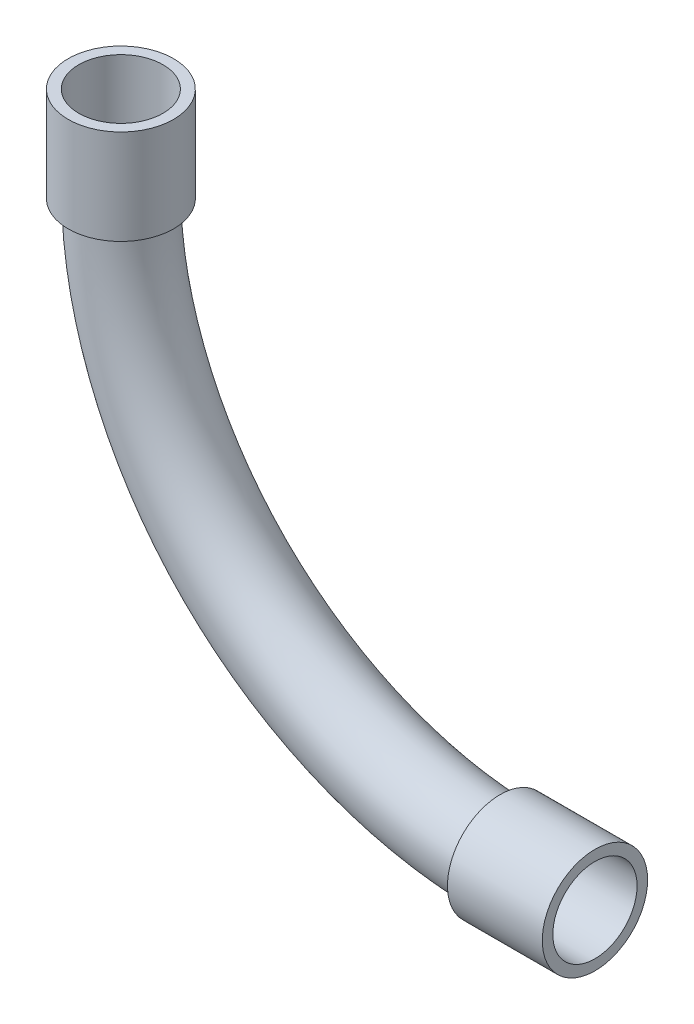
ISO-10303-21;
HEADER;
FILE_DESCRIPTION(('STEP AP214'),'2;1');
FILE_NAME('part.step','',(''),(''),'','','');
FILE_SCHEMA(('AUTOMOTIVE_DESIGN { 1 0 10303 214 1 1 1 1 }'));
ENDSEC;
DATA;
#1=APPLICATION_CONTEXT('core data for automotive mechanical design processes');
#2=APPLICATION_PROTOCOL_DEFINITION('international standard','automotive_design',2000,#1);
#3=PRODUCT_CONTEXT('',#1,'mechanical');
#4=PRODUCT('Part','Part','',(#3));
#5=PRODUCT_RELATED_PRODUCT_CATEGORY('part','',(#4));
#6=PRODUCT_DEFINITION_FORMATION('','',#4);
#7=PRODUCT_DEFINITION_CONTEXT('part definition',#1,'design');
#8=PRODUCT_DEFINITION('design','',#6,#7);
#9=PRODUCT_DEFINITION_SHAPE('','',#8);
#10=(LENGTH_UNIT() NAMED_UNIT(*) SI_UNIT(.MILLI.,.METRE.));
#11=(NAMED_UNIT(*) PLANE_ANGLE_UNIT() SI_UNIT($,.RADIAN.));
#12=(NAMED_UNIT(*) SI_UNIT($,.STERADIAN.) SOLID_ANGLE_UNIT());
#13=UNCERTAINTY_MEASURE_WITH_UNIT(LENGTH_MEASURE(1.E-05),#10,'distance_accuracy_value','');
#14=(GEOMETRIC_REPRESENTATION_CONTEXT(3) GLOBAL_UNCERTAINTY_ASSIGNED_CONTEXT((#13)) GLOBAL_UNIT_ASSIGNED_CONTEXT((#10,
#11,#12)) REPRESENTATION_CONTEXT('',''));
#15=CARTESIAN_POINT('',(0.,0.,0.));
#16=DIRECTION('',(0.,0.,1.));
#17=DIRECTION('',(1.,0.,0.));
#18=AXIS2_PLACEMENT_3D('',#15,#16,#17);
#19=CARTESIAN_POINT('',(0.,72.,0.));
#20=DIRECTION('',(0.,1.,0.));
#21=DIRECTION('',(0.,0.,1.));
#22=AXIS2_PLACEMENT_3D('',#19,#20,#21);
#23=CYLINDRICAL_SURFACE('',#22,10.);
#24=CARTESIAN_POINT('',(0.,72.,0.));
#25=DIRECTION('',(0.,1.,0.));
#26=DIRECTION('',(1.,0.,0.));
#27=AXIS2_PLACEMENT_3D('',#24,#25,#26);
#28=CIRCLE('',#27,10.);
#29=CARTESIAN_POINT('',(10.,72.,0.));
#30=VERTEX_POINT('',#29);
#31=EDGE_CURVE('E12',#30,#30,#28,.T.);
#32=ORIENTED_EDGE('',*,*,#31,.T.);
#33=EDGE_LOOP('',(#32));
#34=FACE_BOUND('',#33,.T.);
#35=CARTESIAN_POINT('',(0.,90.,0.));
#36=DIRECTION('',(0.,1.,0.));
#37=DIRECTION('',(1.,0.,0.));
#38=AXIS2_PLACEMENT_3D('',#35,#36,#37);
#39=CIRCLE('',#38,10.);
#40=CARTESIAN_POINT('',(10.,90.,0.));
#41=VERTEX_POINT('',#40);
#42=EDGE_CURVE('E97',#41,#41,#39,.T.);
#43=ORIENTED_EDGE('',*,*,#42,.F.);
#44=EDGE_LOOP('',(#43));
#45=FACE_BOUND('',#44,.T.);
#46=ADVANCED_FACE('F84',(#34,#45),#23,.T.);
#47=CARTESIAN_POINT('',(0.,72.,0.));
#48=DIRECTION('',(0.,1.,0.));
#49=DIRECTION('',(0.,0.,1.));
#50=AXIS2_PLACEMENT_3D('',#47,#48,#49);
#51=PLANE('',#50);
#52=CARTESIAN_POINT('',(0.,72.,0.));
#53=DIRECTION('',(0.,1.,0.));
#54=DIRECTION('',(0.,0.,1.));
#55=AXIS2_PLACEMENT_3D('',#52,#53,#54);
#56=CIRCLE('',#55,8.);
#57=CARTESIAN_POINT('',(0.,72.,8.));
#58=VERTEX_POINT('',#57);
#59=EDGE_CURVE('E91',#58,#58,#56,.T.);
#60=ORIENTED_EDGE('',*,*,#59,.T.);
#61=EDGE_LOOP('',(#60));
#62=FACE_BOUND('',#61,.T.);
#63=ORIENTED_EDGE('',*,*,#31,.F.);
#64=EDGE_LOOP('',(#63));
#65=FACE_BOUND('',#64,.T.);
#66=ADVANCED_FACE('F120',(#62,#65),#51,.F.);
#67=CARTESIAN_POINT('',(0.,72.,0.));
#68=DIRECTION('',(0.,1.,0.));
#69=DIRECTION('',(0.,0.,1.));
#70=AXIS2_PLACEMENT_3D('',#67,#68,#69);
#71=CYLINDRICAL_SURFACE('',#70,8.);
#72=ORIENTED_EDGE('',*,*,#59,.F.);
#73=EDGE_LOOP('',(#72));
#74=FACE_BOUND('',#73,.T.);
#75=CARTESIAN_POINT('',(0.,90.,0.));
#76=DIRECTION('',(0.,1.,0.));
#77=DIRECTION('',(0.,0.,1.));
#78=AXIS2_PLACEMENT_3D('',#75,#76,#77);
#79=CIRCLE('',#78,8.);
#80=CARTESIAN_POINT('',(0.,90.,8.));
#81=VERTEX_POINT('',#80);
#82=EDGE_CURVE('E103',#81,#81,#79,.T.);
#83=ORIENTED_EDGE('',*,*,#82,.T.);
#84=EDGE_LOOP('',(#83));
#85=FACE_BOUND('',#84,.T.);
#86=ADVANCED_FACE('F111',(#74,#85),#71,.F.);
#87=CARTESIAN_POINT('',(0.,90.,0.));
#88=DIRECTION('',(0.,1.,0.));
#89=DIRECTION('',(0.,0.,1.));
#90=AXIS2_PLACEMENT_3D('',#87,#88,#89);
#91=PLANE('',#90);
#92=ORIENTED_EDGE('',*,*,#42,.T.);
#93=EDGE_LOOP('',(#92));
#94=FACE_BOUND('',#93,.T.);
#95=ORIENTED_EDGE('',*,*,#82,.F.);
#96=EDGE_LOOP('',(#95));
#97=FACE_BOUND('',#96,.T.);
#98=ADVANCED_FACE('F113',(#94,#97),#91,.T.);
#99=CLOSED_SHELL('',(#46,#66,#86,#98));
#100=MANIFOLD_SOLID_BREP('B2',#99);
#101=CARTESIAN_POINT('',(72.,0.,0.));
#102=DIRECTION('',(1.,0.,0.));
#103=DIRECTION('',(0.,0.,-1.));
#104=AXIS2_PLACEMENT_3D('',#101,#102,#103);
#105=CYLINDRICAL_SURFACE('',#104,10.);
#106=CARTESIAN_POINT('',(72.,0.,0.));
#107=DIRECTION('',(1.,0.,0.));
#108=DIRECTION('',(0.,0.,-1.));
#109=AXIS2_PLACEMENT_3D('',#106,#107,#108);
#110=CIRCLE('',#109,10.);
#111=CARTESIAN_POINT('',(72.,0.,-10.));
#112=VERTEX_POINT('',#111);
#113=EDGE_CURVE('E83',#112,#112,#110,.T.);
#114=ORIENTED_EDGE('',*,*,#113,.T.);
#115=EDGE_LOOP('',(#114));
#116=FACE_BOUND('',#115,.T.);
#117=CARTESIAN_POINT('',(90.,0.,0.));
#118=DIRECTION('',(1.,0.,0.));
#119=DIRECTION('',(0.,0.,-1.));
#120=AXIS2_PLACEMENT_3D('',#117,#118,#119);
#121=CIRCLE('',#120,10.);
#122=CARTESIAN_POINT('',(90.,0.,-10.));
#123=VERTEX_POINT('',#122);
#124=EDGE_CURVE('E180',#123,#123,#121,.T.);
#125=ORIENTED_EDGE('',*,*,#124,.F.);
#126=EDGE_LOOP('',(#125));
#127=FACE_BOUND('',#126,.T.);
#128=ADVANCED_FACE('F167',(#116,#127),#105,.T.);
#129=CARTESIAN_POINT('',(72.,0.,0.));
#130=DIRECTION('',(1.,0.,0.));
#131=DIRECTION('',(0.,0.,-1.));
#132=AXIS2_PLACEMENT_3D('',#129,#130,#131);
#133=PLANE('',#132);
#134=CARTESIAN_POINT('',(72.,0.,0.));
#135=DIRECTION('',(1.,0.,0.));
#136=DIRECTION('',(0.,0.,-1.));
#137=AXIS2_PLACEMENT_3D('',#134,#135,#136);
#138=CIRCLE('',#137,8.);
#139=CARTESIAN_POINT('',(72.,0.,-8.));
#140=VERTEX_POINT('',#139);
#141=EDGE_CURVE('E174',#140,#140,#138,.T.);
#142=ORIENTED_EDGE('',*,*,#141,.T.);
#143=EDGE_LOOP('',(#142));
#144=FACE_BOUND('',#143,.T.);
#145=ORIENTED_EDGE('',*,*,#113,.F.);
#146=EDGE_LOOP('',(#145));
#147=FACE_BOUND('',#146,.T.);
#148=ADVANCED_FACE('F203',(#144,#147),#133,.F.);
#149=CARTESIAN_POINT('',(72.,0.,0.));
#150=DIRECTION('',(1.,0.,0.));
#151=DIRECTION('',(0.,0.,-1.));
#152=AXIS2_PLACEMENT_3D('',#149,#150,#151);
#153=CYLINDRICAL_SURFACE('',#152,8.);
#154=ORIENTED_EDGE('',*,*,#141,.F.);
#155=EDGE_LOOP('',(#154));
#156=FACE_BOUND('',#155,.T.);
#157=CARTESIAN_POINT('',(90.,0.,0.));
#158=DIRECTION('',(1.,0.,0.));
#159=DIRECTION('',(0.,0.,-1.));
#160=AXIS2_PLACEMENT_3D('',#157,#158,#159);
#161=CIRCLE('',#160,8.);
#162=CARTESIAN_POINT('',(90.,0.,-8.));
#163=VERTEX_POINT('',#162);
#164=EDGE_CURVE('E186',#163,#163,#161,.T.);
#165=ORIENTED_EDGE('',*,*,#164,.T.);
#166=EDGE_LOOP('',(#165));
#167=FACE_BOUND('',#166,.T.);
#168=ADVANCED_FACE('F194',(#156,#167),#153,.F.);
#169=CARTESIAN_POINT('',(90.,0.,0.));
#170=DIRECTION('',(1.,0.,0.));
#171=DIRECTION('',(0.,0.,-1.));
#172=AXIS2_PLACEMENT_3D('',#169,#170,#171);
#173=PLANE('',#172);
#174=ORIENTED_EDGE('',*,*,#124,.T.);
#175=EDGE_LOOP('',(#174));
#176=FACE_BOUND('',#175,.T.);
#177=ORIENTED_EDGE('',*,*,#164,.F.);
#178=EDGE_LOOP('',(#177));
#179=FACE_BOUND('',#178,.T.);
#180=ADVANCED_FACE('F196',(#176,#179),#173,.T.);
#181=CLOSED_SHELL('',(#128,#148,#168,#180));
#182=MANIFOLD_SOLID_BREP('B7',#181);
#183=CARTESIAN_POINT('',(74.,0.,0.));
#184=DIRECTION('',(1.,0.,0.));
#185=DIRECTION('',(0.,0.,-1.));
#186=AXIS2_PLACEMENT_3D('',#183,#184,#185);
#187=PLANE('',#186);
#188=CARTESIAN_POINT('',(74.,0.,0.));
#189=DIRECTION('',(1.,0.,0.));
#190=DIRECTION('',(0.,0.,-1.));
#191=AXIS2_PLACEMENT_3D('',#188,#189,#190);
#192=CIRCLE('',#191,6.);
#193=CARTESIAN_POINT('',(74.,-6.00000000000001,0.));
#194=VERTEX_POINT('',#193);
#195=EDGE_CURVE('E257',#194,#194,#192,.T.);
#196=ORIENTED_EDGE('',*,*,#195,.F.);
#197=EDGE_LOOP('',(#196));
#198=FACE_BOUND('',#197,.T.);
#199=CARTESIAN_POINT('',(74.,0.,0.));
#200=DIRECTION('',(1.,0.,0.));
#201=DIRECTION('',(0.,0.,-1.));
#202=AXIS2_PLACEMENT_3D('',#199,#200,#201);
#203=CIRCLE('',#202,8.);
#204=CARTESIAN_POINT('',(74.,-7.99999999999999,0.));
#205=VERTEX_POINT('',#204);
#206=EDGE_CURVE('E241',#205,#205,#203,.T.);
#207=ORIENTED_EDGE('',*,*,#206,.T.);
#208=EDGE_LOOP('',(#207));
#209=FACE_BOUND('',#208,.T.);
#210=ADVANCED_FACE('F237',(#198,#209),#187,.T.);
#211=CARTESIAN_POINT('',(0.,74.,0.));
#212=DIRECTION('',(0.,-1.,0.));
#213=DIRECTION('',(0.,0.,-1.));
#214=AXIS2_PLACEMENT_3D('',#211,#212,#213);
#215=PLANE('',#214);
#216=CARTESIAN_POINT('',(0.,74.,0.));
#217=DIRECTION('',(0.,-1.,0.));
#218=DIRECTION('',(0.,0.,-1.));
#219=AXIS2_PLACEMENT_3D('',#216,#217,#218);
#220=CIRCLE('',#219,6.);
#221=CARTESIAN_POINT('',(-6.00000000000001,74.,0.));
#222=VERTEX_POINT('',#221);
#223=EDGE_CURVE('E252',#222,#222,#220,.T.);
#224=ORIENTED_EDGE('',*,*,#223,.T.);
#225=EDGE_LOOP('',(#224));
#226=FACE_BOUND('',#225,.T.);
#227=CARTESIAN_POINT('',(0.,74.,0.));
#228=DIRECTION('',(0.,-1.,0.));
#229=DIRECTION('',(1.,0.,0.));
#230=AXIS2_PLACEMENT_3D('',#227,#228,#229);
#231=CIRCLE('',#230,8.);
#232=CARTESIAN_POINT('',(-7.99999999999999,74.,0.));
#233=VERTEX_POINT('',#232);
#234=EDGE_CURVE('E166',#233,#233,#231,.T.);
#235=ORIENTED_EDGE('',*,*,#234,.F.);
#236=EDGE_LOOP('',(#235));
#237=FACE_BOUND('',#236,.T.);
#238=ADVANCED_FACE('F268',(#226,#237),#215,.F.);
#239=CARTESIAN_POINT('',(74.,74.,0.));
#240=DIRECTION('',(0.,0.,-1.));
#241=DIRECTION('',(-1.,0.,0.));
#242=AXIS2_PLACEMENT_3D('',#239,#240,#241);
#243=TOROIDAL_SURFACE('',#242,74.,8.);
#244=CARTESIAN_POINT('',(74.,74.,0.));
#245=DIRECTION('',(0.,0.,-1.));
#246=DIRECTION('',(-1.,0.,0.));
#247=AXIS2_PLACEMENT_3D('',#244,#245,#246);
#248=CIRCLE('',#247,82.);
#249=EDGE_CURVE('',#205,#233,#248,.T.);
#250=ORIENTED_EDGE('',*,*,#206,.F.);
#251=ORIENTED_EDGE('',*,*,#234,.T.);
#252=ORIENTED_EDGE('',*,*,#249,.T.);
#253=ORIENTED_EDGE('',*,*,#249,.F.);
#254=EDGE_LOOP('',(#250,#252,#251,#253));
#255=FACE_BOUND('',#254,.T.);
#256=ADVANCED_FACE('F239',(#255),#243,.T.);
#257=CARTESIAN_POINT('',(74.,74.,0.));
#258=DIRECTION('',(0.,0.,-1.));
#259=DIRECTION('',(-1.,0.,0.));
#260=AXIS2_PLACEMENT_3D('',#257,#258,#259);
#261=TOROIDAL_SURFACE('',#260,74.,6.);
#262=CARTESIAN_POINT('',(74.,74.,0.));
#263=DIRECTION('',(0.,0.,-1.));
#264=DIRECTION('',(-1.,0.,0.));
#265=AXIS2_PLACEMENT_3D('',#262,#263,#264);
#266=CIRCLE('',#265,80.);
#267=EDGE_CURVE('',#194,#222,#266,.T.);
#268=ORIENTED_EDGE('',*,*,#195,.T.);
#269=ORIENTED_EDGE('',*,*,#223,.F.);
#270=ORIENTED_EDGE('',*,*,#267,.T.);
#271=ORIENTED_EDGE('',*,*,#267,.F.);
#272=EDGE_LOOP('',(#268,#270,#269,#271));
#273=FACE_BOUND('',#272,.T.);
#274=ADVANCED_FACE('F264',(#273),#261,.F.);
#275=CLOSED_SHELL('',(#210,#238,#256,#274));
#276=MANIFOLD_SOLID_BREP('B78',#275);
#277=ADVANCED_BREP_SHAPE_REPRESENTATION('',(#18,#100,#182,#276),#14);
#278=SHAPE_DEFINITION_REPRESENTATION(#9,#277);
ENDSEC;
END-ISO-10303-21;
